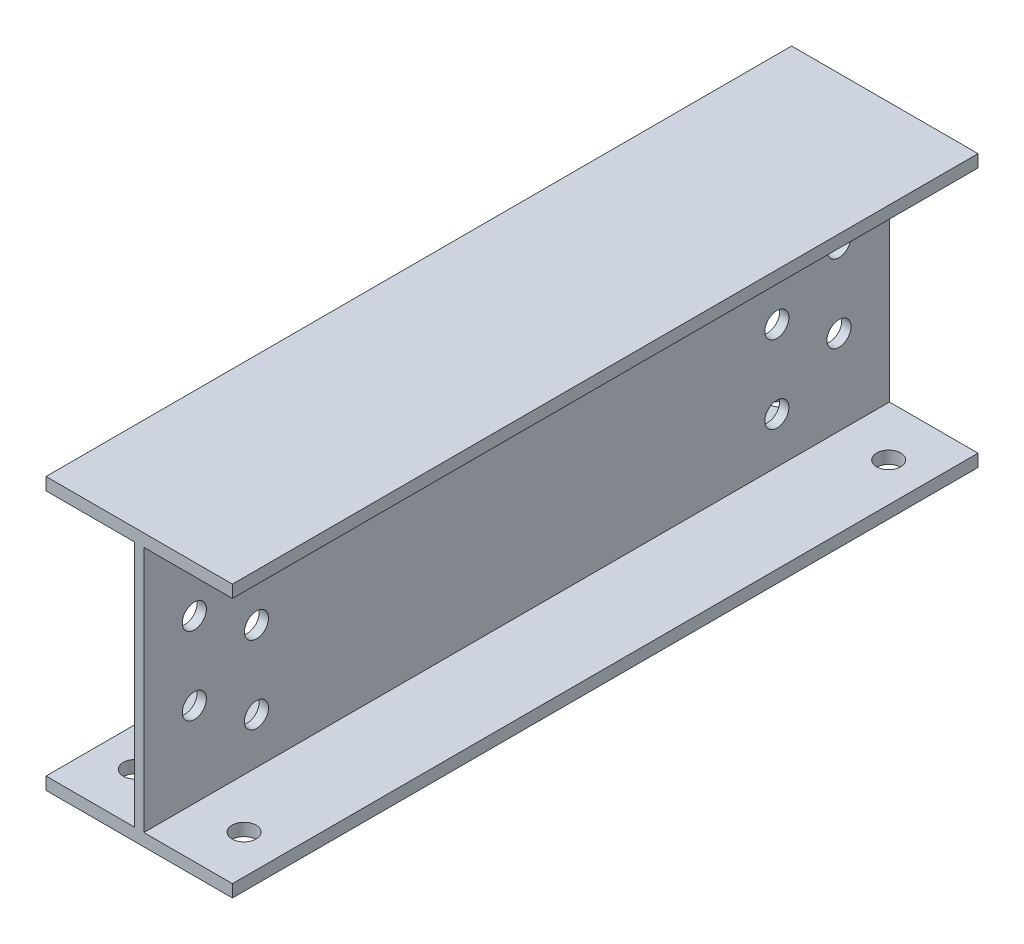
ISO-10303-21;
HEADER;
FILE_DESCRIPTION(('STEP AP214'),'2;1');
FILE_NAME('part.step','',(''),(''),'','','');
FILE_SCHEMA(('AUTOMOTIVE_DESIGN { 1 0 10303 214 1 1 1 1 }'));
ENDSEC;
DATA;
#1=APPLICATION_CONTEXT('core data for automotive mechanical design processes');
#2=APPLICATION_PROTOCOL_DEFINITION('international standard','automotive_design',2000,#1);
#3=PRODUCT_CONTEXT('',#1,'mechanical');
#4=PRODUCT('Part','Part','',(#3));
#5=PRODUCT_RELATED_PRODUCT_CATEGORY('part','',(#4));
#6=PRODUCT_DEFINITION_FORMATION('','',#4);
#7=PRODUCT_DEFINITION_CONTEXT('part definition',#1,'design');
#8=PRODUCT_DEFINITION('design','',#6,#7);
#9=PRODUCT_DEFINITION_SHAPE('','',#8);
#10=(LENGTH_UNIT() NAMED_UNIT(*) SI_UNIT(.MILLI.,.METRE.));
#11=(NAMED_UNIT(*) PLANE_ANGLE_UNIT() SI_UNIT($,.RADIAN.));
#12=(NAMED_UNIT(*) SI_UNIT($,.STERADIAN.) SOLID_ANGLE_UNIT());
#13=UNCERTAINTY_MEASURE_WITH_UNIT(LENGTH_MEASURE(1.E-05),#10,'distance_accuracy_value','');
#14=(GEOMETRIC_REPRESENTATION_CONTEXT(3) GLOBAL_UNCERTAINTY_ASSIGNED_CONTEXT((#13)) GLOBAL_UNIT_ASSIGNED_CONTEXT((#10,
#11,#12)) REPRESENTATION_CONTEXT('',''));
#15=CARTESIAN_POINT('',(0.,0.,0.));
#16=DIRECTION('',(0.,0.,1.));
#17=DIRECTION('',(1.,0.,0.));
#18=AXIS2_PLACEMENT_3D('',#15,#16,#17);
#19=CARTESIAN_POINT('',(-6.00000000000005,-159.,480.));
#20=DIRECTION('',(1.,0.,0.));
#21=DIRECTION('',(0.,1.,0.));
#22=AXIS2_PLACEMENT_3D('',#19,#20,#21);
#23=PLANE('',#22);
#24=CARTESIAN_POINT('',(-6.00000000000003,-100.,334.999961202877));
#25=DIRECTION('',(1.,0.,0.));
#26=DIRECTION('',(0.,1.,0.));
#27=AXIS2_PLACEMENT_3D('',#24,#25,#26);
#28=CIRCLE('',#27,15.5);
#29=CARTESIAN_POINT('',(-6.00000000000003,-84.5,334.999961202877));
#30=VERTEX_POINT('',#29);
#31=EDGE_CURVE('E234',#30,#30,#28,.T.);
#32=ORIENTED_EDGE('',*,*,#31,.T.);
#33=EDGE_LOOP('',(#32));
#34=FACE_BOUND('',#33,.T.);
#35=CARTESIAN_POINT('',(-6.00000000000002,50.,-415.));
#36=DIRECTION('',(1.,0.,0.));
#37=DIRECTION('',(0.,1.,0.));
#38=AXIS2_PLACEMENT_3D('',#35,#36,#37);
#39=CIRCLE('',#38,15.5);
#40=CARTESIAN_POINT('',(-6.00000000000002,65.5,-415.));
#41=VERTEX_POINT('',#40);
#42=EDGE_CURVE('E231',#41,#41,#39,.T.);
#43=ORIENTED_EDGE('',*,*,#42,.T.);
#44=EDGE_LOOP('',(#43));
#45=FACE_BOUND('',#44,.T.);
#46=CARTESIAN_POINT('',(-6.00000000000001,100.,-334.999961202877));
#47=DIRECTION('',(1.,0.,0.));
#48=DIRECTION('',(0.,1.,0.));
#49=AXIS2_PLACEMENT_3D('',#46,#47,#48);
#50=CIRCLE('',#49,15.5);
#51=CARTESIAN_POINT('',(-6.,115.5,-334.999961202877));
#52=VERTEX_POINT('',#51);
#53=EDGE_CURVE('E228',#52,#52,#50,.T.);
#54=ORIENTED_EDGE('',*,*,#53,.T.);
#55=EDGE_LOOP('',(#54));
#56=FACE_BOUND('',#55,.T.);
#57=CARTESIAN_POINT('',(-6.00000000000002,0.,-334.999961202877));
#58=DIRECTION('',(1.,0.,0.));
#59=DIRECTION('',(0.,1.,0.));
#60=AXIS2_PLACEMENT_3D('',#57,#58,#59);
#61=CIRCLE('',#60,15.5);
#62=CARTESIAN_POINT('',(-6.00000000000002,15.5,-334.999961202877));
#63=VERTEX_POINT('',#62);
#64=EDGE_CURVE('E224',#63,#63,#61,.T.);
#65=ORIENTED_EDGE('',*,*,#64,.T.);
#66=EDGE_LOOP('',(#65));
#67=FACE_BOUND('',#66,.T.);
#68=CARTESIAN_POINT('',(-6.00000000000003,-100.,-334.999961202877));
#69=DIRECTION('',(1.,0.,0.));
#70=DIRECTION('',(0.,1.,0.));
#71=AXIS2_PLACEMENT_3D('',#68,#69,#70);
#72=CIRCLE('',#71,15.5);
#73=CARTESIAN_POINT('',(-6.00000000000003,-84.5,-334.999961202877));
#74=VERTEX_POINT('',#73);
#75=EDGE_CURVE('E220',#74,#74,#72,.T.);
#76=ORIENTED_EDGE('',*,*,#75,.T.);
#77=EDGE_LOOP('',(#76));
#78=FACE_BOUND('',#77,.T.);
#79=CARTESIAN_POINT('',(-6.00000000000003,-50.,-415.));
#80=DIRECTION('',(1.,0.,0.));
#81=DIRECTION('',(0.,1.,0.));
#82=AXIS2_PLACEMENT_3D('',#79,#80,#81);
#83=CIRCLE('',#82,15.5);
#84=CARTESIAN_POINT('',(-6.00000000000003,-34.5,-415.));
#85=VERTEX_POINT('',#84);
#86=EDGE_CURVE('E216',#85,#85,#83,.T.);
#87=ORIENTED_EDGE('',*,*,#86,.T.);
#88=EDGE_LOOP('',(#87));
#89=FACE_BOUND('',#88,.T.);
#90=CARTESIAN_POINT('',(-6.00000000000003,-50.,415.));
#91=DIRECTION('',(1.,0.,0.));
#92=DIRECTION('',(0.,1.,0.));
#93=AXIS2_PLACEMENT_3D('',#90,#91,#92);
#94=CIRCLE('',#93,15.5);
#95=CARTESIAN_POINT('',(-6.00000000000003,-34.5,415.));
#96=VERTEX_POINT('',#95);
#97=EDGE_CURVE('E212',#96,#96,#94,.T.);
#98=ORIENTED_EDGE('',*,*,#97,.T.);
#99=EDGE_LOOP('',(#98));
#100=FACE_BOUND('',#99,.T.);
#101=CARTESIAN_POINT('',(-6.00000000000002,0.,334.999961202877));
#102=DIRECTION('',(1.,0.,0.));
#103=DIRECTION('',(0.,1.,0.));
#104=AXIS2_PLACEMENT_3D('',#101,#102,#103);
#105=CIRCLE('',#104,15.5);
#106=CARTESIAN_POINT('',(-6.00000000000002,15.5,334.999961202877));
#107=VERTEX_POINT('',#106);
#108=EDGE_CURVE('E208',#107,#107,#105,.T.);
#109=ORIENTED_EDGE('',*,*,#108,.T.);
#110=EDGE_LOOP('',(#109));
#111=FACE_BOUND('',#110,.T.);
#112=CARTESIAN_POINT('',(-6.00000000000001,100.,334.999961202877));
#113=DIRECTION('',(1.,0.,0.));
#114=DIRECTION('',(0.,1.,0.));
#115=AXIS2_PLACEMENT_3D('',#112,#113,#114);
#116=CIRCLE('',#115,15.5);
#117=CARTESIAN_POINT('',(-6.,115.5,334.999961202877));
#118=VERTEX_POINT('',#117);
#119=EDGE_CURVE('E204',#118,#118,#116,.T.);
#120=ORIENTED_EDGE('',*,*,#119,.T.);
#121=EDGE_LOOP('',(#120));
#122=FACE_BOUND('',#121,.T.);
#123=CARTESIAN_POINT('',(-6.00000000000002,50.,415.));
#124=DIRECTION('',(1.,0.,0.));
#125=DIRECTION('',(0.,1.,0.));
#126=AXIS2_PLACEMENT_3D('',#123,#124,#125);
#127=CIRCLE('',#126,15.5);
#128=CARTESIAN_POINT('',(-6.00000000000002,65.5,415.));
#129=VERTEX_POINT('',#128);
#130=EDGE_CURVE('E158',#129,#129,#127,.T.);
#131=ORIENTED_EDGE('',*,*,#130,.T.);
#132=EDGE_LOOP('',(#131));
#133=FACE_BOUND('',#132,.T.);
#134=DIRECTION('',(0.,-1.,0.));
#135=VECTOR('',#134,1.);
#136=CARTESIAN_POINT('',(-6.00000000000005,-159.,-480.));
#137=LINE('',#136,#135);
#138=CARTESIAN_POINT('',(-6.,159.,-480.));
#139=VERTEX_POINT('',#138);
#140=CARTESIAN_POINT('',(-6.00000000000005,-159.,-480.));
#141=VERTEX_POINT('',#140);
#142=EDGE_CURVE('E154',#139,#141,#137,.T.);
#143=ORIENTED_EDGE('',*,*,#142,.T.);
#144=DIRECTION('',(0.,0.,-1.));
#145=VECTOR('',#144,1.);
#146=CARTESIAN_POINT('',(-6.00000000000005,-159.,480.));
#147=LINE('',#146,#145);
#148=CARTESIAN_POINT('',(-6.00000000000005,-159.,480.));
#149=VERTEX_POINT('',#148);
#150=EDGE_CURVE('E11',#149,#141,#147,.T.);
#151=ORIENTED_EDGE('',*,*,#150,.F.);
#152=DIRECTION('',(0.,-1.,0.));
#153=VECTOR('',#152,1.);
#154=CARTESIAN_POINT('',(-6.00000000000005,-159.,480.));
#155=LINE('',#154,#153);
#156=CARTESIAN_POINT('',(-6.,159.,480.));
#157=VERTEX_POINT('',#156);
#158=EDGE_CURVE('E177',#157,#149,#155,.T.);
#159=ORIENTED_EDGE('',*,*,#158,.F.);
#160=DIRECTION('',(0.,0.,-1.));
#161=VECTOR('',#160,1.);
#162=CARTESIAN_POINT('',(-6.,159.,480.));
#163=LINE('',#162,#161);
#164=EDGE_CURVE('E150',#157,#139,#163,.T.);
#165=ORIENTED_EDGE('',*,*,#164,.T.);
#166=EDGE_LOOP('',(#143,#151,#159,#165));
#167=FACE_BOUND('',#166,.T.);
#168=ADVANCED_FACE('F32',(#34,#45,#56,#67,#78,#89,#100,#111,#122,#133,#167),#23,.F.);
#169=CARTESIAN_POINT('',(-120.,-159.,480.));
#170=DIRECTION('',(0.,-1.,0.));
#171=DIRECTION('',(0.,0.,-1.));
#172=AXIS2_PLACEMENT_3D('',#169,#170,#171);
#173=PLANE('',#172);
#174=CARTESIAN_POINT('',(-70.,-159.,415.));
#175=DIRECTION('',(0.,1.,0.));
#176=DIRECTION('',(0.,0.,-1.));
#177=AXIS2_PLACEMENT_3D('',#174,#175,#176);
#178=CIRCLE('',#177,15.5);
#179=CARTESIAN_POINT('',(-70.,-159.,399.5));
#180=VERTEX_POINT('',#179);
#181=EDGE_CURVE('E402',#180,#180,#178,.T.);
#182=ORIENTED_EDGE('',*,*,#181,.F.);
#183=EDGE_LOOP('',(#182));
#184=FACE_BOUND('',#183,.T.);
#185=CARTESIAN_POINT('',(-70.,-159.,-415.));
#186=DIRECTION('',(0.,1.,0.));
#187=DIRECTION('',(0.,0.,1.));
#188=AXIS2_PLACEMENT_3D('',#185,#186,#187);
#189=CIRCLE('',#188,15.5);
#190=CARTESIAN_POINT('',(-70.,-159.,-399.5));
#191=VERTEX_POINT('',#190);
#192=EDGE_CURVE('E246',#191,#191,#189,.T.);
#193=ORIENTED_EDGE('',*,*,#192,.F.);
#194=EDGE_LOOP('',(#193));
#195=FACE_BOUND('',#194,.T.);
#196=DIRECTION('',(-1.,0.,0.));
#197=VECTOR('',#196,1.);
#198=CARTESIAN_POINT('',(-120.,-159.,-480.));
#199=LINE('',#198,#197);
#200=CARTESIAN_POINT('',(-120.,-159.,-480.));
#201=VERTEX_POINT('',#200);
#202=EDGE_CURVE('E157',#141,#201,#199,.T.);
#203=ORIENTED_EDGE('',*,*,#202,.T.);
#204=DIRECTION('',(0.,0.,-1.));
#205=VECTOR('',#204,1.);
#206=CARTESIAN_POINT('',(-120.,-159.,480.));
#207=LINE('',#206,#205);
#208=CARTESIAN_POINT('',(-120.,-159.,480.));
#209=VERTEX_POINT('',#208);
#210=EDGE_CURVE('E41',#209,#201,#207,.T.);
#211=ORIENTED_EDGE('',*,*,#210,.F.);
#212=DIRECTION('',(-1.,0.,0.));
#213=VECTOR('',#212,1.);
#214=CARTESIAN_POINT('',(-120.,-159.,480.));
#215=LINE('',#214,#213);
#216=EDGE_CURVE('E105',#149,#209,#215,.T.);
#217=ORIENTED_EDGE('',*,*,#216,.F.);
#218=ORIENTED_EDGE('',*,*,#150,.T.);
#219=EDGE_LOOP('',(#203,#211,#217,#218));
#220=FACE_BOUND('',#219,.T.);
#221=ADVANCED_FACE('F306',(#184,#195,#220),#173,.F.);
#222=CARTESIAN_POINT('',(-120.,-175.,480.));
#223=DIRECTION('',(1.,0.,0.));
#224=DIRECTION('',(0.,0.,-1.));
#225=AXIS2_PLACEMENT_3D('',#222,#223,#224);
#226=PLANE('',#225);
#227=DIRECTION('',(0.,-1.,0.));
#228=VECTOR('',#227,1.);
#229=CARTESIAN_POINT('',(-120.,-175.,-480.));
#230=LINE('',#229,#228);
#231=CARTESIAN_POINT('',(-120.,-175.,-480.));
#232=VERTEX_POINT('',#231);
#233=EDGE_CURVE('E160',#201,#232,#230,.T.);
#234=ORIENTED_EDGE('',*,*,#233,.T.);
#235=DIRECTION('',(0.,0.,-1.));
#236=VECTOR('',#235,1.);
#237=CARTESIAN_POINT('',(-120.,-175.,480.));
#238=LINE('',#237,#236);
#239=CARTESIAN_POINT('',(-120.,-175.,480.));
#240=VERTEX_POINT('',#239);
#241=EDGE_CURVE('E196',#240,#232,#238,.T.);
#242=ORIENTED_EDGE('',*,*,#241,.F.);
#243=DIRECTION('',(0.,-1.,0.));
#244=VECTOR('',#243,1.);
#245=CARTESIAN_POINT('',(-120.,-175.,480.));
#246=LINE('',#245,#244);
#247=EDGE_CURVE('E267',#209,#240,#246,.T.);
#248=ORIENTED_EDGE('',*,*,#247,.F.);
#249=ORIENTED_EDGE('',*,*,#210,.T.);
#250=EDGE_LOOP('',(#234,#242,#248,#249));
#251=FACE_BOUND('',#250,.T.);
#252=ADVANCED_FACE('F310',(#251),#226,.F.);
#253=CARTESIAN_POINT('',(120.,-175.,480.));
#254=DIRECTION('',(0.,1.,0.));
#255=DIRECTION('',(-1.,0.,0.));
#256=AXIS2_PLACEMENT_3D('',#253,#254,#255);
#257=PLANE('',#256);
#258=CARTESIAN_POINT('',(70.,-175.,415.));
#259=DIRECTION('',(0.,1.,0.));
#260=DIRECTION('',(0.,0.,-1.));
#261=AXIS2_PLACEMENT_3D('',#258,#259,#260);
#262=CIRCLE('',#261,15.5);
#263=CARTESIAN_POINT('',(70.,-175.,399.5));
#264=VERTEX_POINT('',#263);
#265=EDGE_CURVE('E396',#264,#264,#262,.T.);
#266=ORIENTED_EDGE('',*,*,#265,.T.);
#267=EDGE_LOOP('',(#266));
#268=FACE_BOUND('',#267,.T.);
#269=CARTESIAN_POINT('',(-70.,-175.,415.));
#270=DIRECTION('',(0.,1.,0.));
#271=DIRECTION('',(0.,0.,-1.));
#272=AXIS2_PLACEMENT_3D('',#269,#270,#271);
#273=CIRCLE('',#272,15.5);
#274=CARTESIAN_POINT('',(-70.,-175.,399.5));
#275=VERTEX_POINT('',#274);
#276=EDGE_CURVE('E405',#275,#275,#273,.T.);
#277=ORIENTED_EDGE('',*,*,#276,.T.);
#278=EDGE_LOOP('',(#277));
#279=FACE_BOUND('',#278,.T.);
#280=CARTESIAN_POINT('',(70.,-175.,-415.));
#281=DIRECTION('',(0.,1.,0.));
#282=DIRECTION('',(0.,0.,1.));
#283=AXIS2_PLACEMENT_3D('',#280,#281,#282);
#284=CIRCLE('',#283,15.5);
#285=CARTESIAN_POINT('',(70.,-175.,-399.5));
#286=VERTEX_POINT('',#285);
#287=EDGE_CURVE('E411',#286,#286,#284,.T.);
#288=ORIENTED_EDGE('',*,*,#287,.T.);
#289=EDGE_LOOP('',(#288));
#290=FACE_BOUND('',#289,.T.);
#291=CARTESIAN_POINT('',(-70.,-175.,-415.));
#292=DIRECTION('',(0.,1.,0.));
#293=DIRECTION('',(0.,0.,1.));
#294=AXIS2_PLACEMENT_3D('',#291,#292,#293);
#295=CIRCLE('',#294,15.5);
#296=CARTESIAN_POINT('',(-70.,-175.,-399.5));
#297=VERTEX_POINT('',#296);
#298=EDGE_CURVE('E244',#297,#297,#295,.T.);
#299=ORIENTED_EDGE('',*,*,#298,.T.);
#300=EDGE_LOOP('',(#299));
#301=FACE_BOUND('',#300,.T.);
#302=DIRECTION('',(1.,0.,0.));
#303=VECTOR('',#302,1.);
#304=CARTESIAN_POINT('',(120.,-175.,-480.));
#305=LINE('',#304,#303);
#306=CARTESIAN_POINT('',(120.,-175.,-480.));
#307=VERTEX_POINT('',#306);
#308=EDGE_CURVE('E162',#232,#307,#305,.T.);
#309=ORIENTED_EDGE('',*,*,#308,.T.);
#310=DIRECTION('',(0.,0.,-1.));
#311=VECTOR('',#310,1.);
#312=CARTESIAN_POINT('',(120.,-175.,480.));
#313=LINE('',#312,#311);
#314=CARTESIAN_POINT('',(120.,-175.,480.));
#315=VERTEX_POINT('',#314);
#316=EDGE_CURVE('E193',#315,#307,#313,.T.);
#317=ORIENTED_EDGE('',*,*,#316,.F.);
#318=DIRECTION('',(1.,0.,0.));
#319=VECTOR('',#318,1.);
#320=CARTESIAN_POINT('',(120.,-175.,480.));
#321=LINE('',#320,#319);
#322=EDGE_CURVE('E269',#240,#315,#321,.T.);
#323=ORIENTED_EDGE('',*,*,#322,.F.);
#324=ORIENTED_EDGE('',*,*,#241,.T.);
#325=EDGE_LOOP('',(#309,#317,#323,#324));
#326=FACE_BOUND('',#325,.T.);
#327=ADVANCED_FACE('F430',(#268,#279,#290,#301,#326),#257,.F.);
#328=CARTESIAN_POINT('',(120.,-159.,480.));
#329=DIRECTION('',(-1.,0.,0.));
#330=DIRECTION('',(0.,0.,1.));
#331=AXIS2_PLACEMENT_3D('',#328,#329,#330);
#332=PLANE('',#331);
#333=DIRECTION('',(0.,1.,0.));
#334=VECTOR('',#333,1.);
#335=CARTESIAN_POINT('',(120.,-159.,-480.));
#336=LINE('',#335,#334);
#337=CARTESIAN_POINT('',(120.,-159.,-480.));
#338=VERTEX_POINT('',#337);
#339=EDGE_CURVE('E164',#307,#338,#336,.T.);
#340=ORIENTED_EDGE('',*,*,#339,.T.);
#341=DIRECTION('',(0.,0.,-1.));
#342=VECTOR('',#341,1.);
#343=CARTESIAN_POINT('',(120.,-159.,480.));
#344=LINE('',#343,#342);
#345=CARTESIAN_POINT('',(120.,-159.,480.));
#346=VERTEX_POINT('',#345);
#347=EDGE_CURVE('E190',#346,#338,#344,.T.);
#348=ORIENTED_EDGE('',*,*,#347,.F.);
#349=DIRECTION('',(0.,1.,0.));
#350=VECTOR('',#349,1.);
#351=CARTESIAN_POINT('',(120.,-159.,480.));
#352=LINE('',#351,#350);
#353=EDGE_CURVE('E271',#315,#346,#352,.T.);
#354=ORIENTED_EDGE('',*,*,#353,.F.);
#355=ORIENTED_EDGE('',*,*,#316,.T.);
#356=EDGE_LOOP('',(#340,#348,#354,#355));
#357=FACE_BOUND('',#356,.T.);
#358=ADVANCED_FACE('F434',(#357),#332,.F.);
#359=CARTESIAN_POINT('',(6.00000000000005,-159.,480.));
#360=DIRECTION('',(0.,-1.,0.));
#361=DIRECTION('',(1.,0.,0.));
#362=AXIS2_PLACEMENT_3D('',#359,#360,#361);
#363=PLANE('',#362);
#364=CARTESIAN_POINT('',(70.,-159.,415.));
#365=DIRECTION('',(0.,1.,0.));
#366=DIRECTION('',(0.,0.,-1.));
#367=AXIS2_PLACEMENT_3D('',#364,#365,#366);
#368=CIRCLE('',#367,15.5);
#369=CARTESIAN_POINT('',(70.,-159.,399.5));
#370=VERTEX_POINT('',#369);
#371=EDGE_CURVE('E399',#370,#370,#368,.T.);
#372=ORIENTED_EDGE('',*,*,#371,.F.);
#373=EDGE_LOOP('',(#372));
#374=FACE_BOUND('',#373,.T.);
#375=CARTESIAN_POINT('',(70.,-159.,-415.));
#376=DIRECTION('',(0.,1.,0.));
#377=DIRECTION('',(0.,0.,1.));
#378=AXIS2_PLACEMENT_3D('',#375,#376,#377);
#379=CIRCLE('',#378,15.5);
#380=CARTESIAN_POINT('',(70.,-159.,-399.5));
#381=VERTEX_POINT('',#380);
#382=EDGE_CURVE('E408',#381,#381,#379,.T.);
#383=ORIENTED_EDGE('',*,*,#382,.F.);
#384=EDGE_LOOP('',(#383));
#385=FACE_BOUND('',#384,.T.);
#386=DIRECTION('',(-1.,0.,0.));
#387=VECTOR('',#386,1.);
#388=CARTESIAN_POINT('',(6.00000000000005,-159.,-480.));
#389=LINE('',#388,#387);
#390=CARTESIAN_POINT('',(6.00000000000005,-159.,-480.));
#391=VERTEX_POINT('',#390);
#392=EDGE_CURVE('E166',#338,#391,#389,.T.);
#393=ORIENTED_EDGE('',*,*,#392,.T.);
#394=DIRECTION('',(0.,0.,-1.));
#395=VECTOR('',#394,1.);
#396=CARTESIAN_POINT('',(6.00000000000005,-159.,480.));
#397=LINE('',#396,#395);
#398=CARTESIAN_POINT('',(6.00000000000005,-159.,480.));
#399=VERTEX_POINT('',#398);
#400=EDGE_CURVE('E187',#399,#391,#397,.T.);
#401=ORIENTED_EDGE('',*,*,#400,.F.);
#402=DIRECTION('',(-1.,0.,0.));
#403=VECTOR('',#402,1.);
#404=CARTESIAN_POINT('',(6.00000000000005,-159.,480.));
#405=LINE('',#404,#403);
#406=EDGE_CURVE('E273',#346,#399,#405,.T.);
#407=ORIENTED_EDGE('',*,*,#406,.F.);
#408=ORIENTED_EDGE('',*,*,#347,.T.);
#409=EDGE_LOOP('',(#393,#401,#407,#408));
#410=FACE_BOUND('',#409,.T.);
#411=ADVANCED_FACE('F439',(#374,#385,#410),#363,.F.);
#412=CARTESIAN_POINT('',(6.,159.,480.));
#413=DIRECTION('',(-1.,0.,0.));
#414=DIRECTION('',(0.,-1.,0.));
#415=AXIS2_PLACEMENT_3D('',#412,#413,#414);
#416=PLANE('',#415);
#417=CARTESIAN_POINT('',(6.00000000000003,-100.,334.999961202877));
#418=DIRECTION('',(-1.,0.,0.));
#419=DIRECTION('',(0.,-1.,0.));
#420=AXIS2_PLACEMENT_3D('',#417,#418,#419);
#421=CIRCLE('',#420,15.5);
#422=CARTESIAN_POINT('',(6.00000000000004,-115.5,334.999961202877));
#423=VERTEX_POINT('',#422);
#424=EDGE_CURVE('E35',#423,#423,#421,.T.);
#425=ORIENTED_EDGE('',*,*,#424,.T.);
#426=EDGE_LOOP('',(#425));
#427=FACE_BOUND('',#426,.T.);
#428=CARTESIAN_POINT('',(6.00000000000003,50.,-415.));
#429=DIRECTION('',(-1.,0.,0.));
#430=DIRECTION('',(0.,-1.,0.));
#431=AXIS2_PLACEMENT_3D('',#428,#429,#430);
#432=CIRCLE('',#431,15.5);
#433=CARTESIAN_POINT('',(6.00000000000004,34.5,-415.));
#434=VERTEX_POINT('',#433);
#435=EDGE_CURVE('E232',#434,#434,#432,.T.);
#436=ORIENTED_EDGE('',*,*,#435,.T.);
#437=EDGE_LOOP('',(#436));
#438=FACE_BOUND('',#437,.T.);
#439=CARTESIAN_POINT('',(6.00000000000001,100.,-334.999961202877));
#440=DIRECTION('',(-1.,0.,0.));
#441=DIRECTION('',(0.,-1.,0.));
#442=AXIS2_PLACEMENT_3D('',#439,#440,#441);
#443=CIRCLE('',#442,15.5);
#444=CARTESIAN_POINT('',(6.00000000000001,84.5,-334.999961202877));
#445=VERTEX_POINT('',#444);
#446=EDGE_CURVE('E229',#445,#445,#443,.T.);
#447=ORIENTED_EDGE('',*,*,#446,.T.);
#448=EDGE_LOOP('',(#447));
#449=FACE_BOUND('',#448,.T.);
#450=CARTESIAN_POINT('',(6.00000000000003,0.,-334.999961202877));
#451=DIRECTION('',(-1.,0.,0.));
#452=DIRECTION('',(0.,-1.,0.));
#453=AXIS2_PLACEMENT_3D('',#450,#451,#452);
#454=CIRCLE('',#453,15.5);
#455=CARTESIAN_POINT('',(6.00000000000004,-15.5,-334.999961202877));
#456=VERTEX_POINT('',#455);
#457=EDGE_CURVE('E225',#456,#456,#454,.T.);
#458=ORIENTED_EDGE('',*,*,#457,.T.);
#459=EDGE_LOOP('',(#458));
#460=FACE_BOUND('',#459,.T.);
#461=CARTESIAN_POINT('',(6.00000000000003,-100.,-334.999961202877));
#462=DIRECTION('',(-1.,0.,0.));
#463=DIRECTION('',(0.,-1.,0.));
#464=AXIS2_PLACEMENT_3D('',#461,#462,#463);
#465=CIRCLE('',#464,15.5);
#466=CARTESIAN_POINT('',(6.00000000000004,-115.5,-334.999961202877));
#467=VERTEX_POINT('',#466);
#468=EDGE_CURVE('E221',#467,#467,#465,.T.);
#469=ORIENTED_EDGE('',*,*,#468,.T.);
#470=EDGE_LOOP('',(#469));
#471=FACE_BOUND('',#470,.T.);
#472=CARTESIAN_POINT('',(6.00000000000003,-50.,-415.));
#473=DIRECTION('',(-1.,0.,0.));
#474=DIRECTION('',(0.,-1.,0.));
#475=AXIS2_PLACEMENT_3D('',#472,#473,#474);
#476=CIRCLE('',#475,15.5);
#477=CARTESIAN_POINT('',(6.00000000000004,-65.5,-415.));
#478=VERTEX_POINT('',#477);
#479=EDGE_CURVE('E217',#478,#478,#476,.T.);
#480=ORIENTED_EDGE('',*,*,#479,.T.);
#481=EDGE_LOOP('',(#480));
#482=FACE_BOUND('',#481,.T.);
#483=CARTESIAN_POINT('',(6.00000000000003,-50.,415.));
#484=DIRECTION('',(-1.,0.,0.));
#485=DIRECTION('',(0.,-1.,0.));
#486=AXIS2_PLACEMENT_3D('',#483,#484,#485);
#487=CIRCLE('',#486,15.5);
#488=CARTESIAN_POINT('',(6.00000000000004,-65.5,415.));
#489=VERTEX_POINT('',#488);
#490=EDGE_CURVE('E213',#489,#489,#487,.T.);
#491=ORIENTED_EDGE('',*,*,#490,.T.);
#492=EDGE_LOOP('',(#491));
#493=FACE_BOUND('',#492,.T.);
#494=CARTESIAN_POINT('',(6.00000000000003,0.,334.999961202877));
#495=DIRECTION('',(-1.,0.,0.));
#496=DIRECTION('',(0.,-1.,0.));
#497=AXIS2_PLACEMENT_3D('',#494,#495,#496);
#498=CIRCLE('',#497,15.5);
#499=CARTESIAN_POINT('',(6.00000000000004,-15.5,334.999961202877));
#500=VERTEX_POINT('',#499);
#501=EDGE_CURVE('E209',#500,#500,#498,.T.);
#502=ORIENTED_EDGE('',*,*,#501,.T.);
#503=EDGE_LOOP('',(#502));
#504=FACE_BOUND('',#503,.T.);
#505=CARTESIAN_POINT('',(6.00000000000001,100.,334.999961202877));
#506=DIRECTION('',(-1.,0.,0.));
#507=DIRECTION('',(0.,-1.,0.));
#508=AXIS2_PLACEMENT_3D('',#505,#506,#507);
#509=CIRCLE('',#508,15.5);
#510=CARTESIAN_POINT('',(6.00000000000001,84.5,334.999961202877));
#511=VERTEX_POINT('',#510);
#512=EDGE_CURVE('E205',#511,#511,#509,.T.);
#513=ORIENTED_EDGE('',*,*,#512,.T.);
#514=EDGE_LOOP('',(#513));
#515=FACE_BOUND('',#514,.T.);
#516=CARTESIAN_POINT('',(6.00000000000003,50.,415.));
#517=DIRECTION('',(-1.,0.,0.));
#518=DIRECTION('',(0.,-1.,0.));
#519=AXIS2_PLACEMENT_3D('',#516,#517,#518);
#520=CIRCLE('',#519,15.5);
#521=CARTESIAN_POINT('',(6.00000000000004,34.5,415.));
#522=VERTEX_POINT('',#521);
#523=EDGE_CURVE('E201',#522,#522,#520,.T.);
#524=ORIENTED_EDGE('',*,*,#523,.T.);
#525=EDGE_LOOP('',(#524));
#526=FACE_BOUND('',#525,.T.);
#527=DIRECTION('',(0.,1.,0.));
#528=VECTOR('',#527,1.);
#529=CARTESIAN_POINT('',(6.,159.,-480.));
#530=LINE('',#529,#528);
#531=CARTESIAN_POINT('',(6.,159.,-480.));
#532=VERTEX_POINT('',#531);
#533=EDGE_CURVE('E168',#391,#532,#530,.T.);
#534=ORIENTED_EDGE('',*,*,#533,.T.);
#535=DIRECTION('',(0.,0.,-1.));
#536=VECTOR('',#535,1.);
#537=CARTESIAN_POINT('',(6.,159.,480.));
#538=LINE('',#537,#536);
#539=CARTESIAN_POINT('',(6.,159.,480.));
#540=VERTEX_POINT('',#539);
#541=EDGE_CURVE('E184',#540,#532,#538,.T.);
#542=ORIENTED_EDGE('',*,*,#541,.F.);
#543=DIRECTION('',(0.,1.,0.));
#544=VECTOR('',#543,1.);
#545=CARTESIAN_POINT('',(6.,159.,480.));
#546=LINE('',#545,#544);
#547=EDGE_CURVE('E275',#399,#540,#546,.T.);
#548=ORIENTED_EDGE('',*,*,#547,.F.);
#549=ORIENTED_EDGE('',*,*,#400,.T.);
#550=EDGE_LOOP('',(#534,#542,#548,#549));
#551=FACE_BOUND('',#550,.T.);
#552=ADVANCED_FACE('F442',(#427,#438,#449,#460,#471,#482,#493,#504,#515,#526,#551),#416,.F.);
#553=CARTESIAN_POINT('',(120.,159.,480.));
#554=DIRECTION('',(0.,1.,0.));
#555=DIRECTION('',(0.,0.,1.));
#556=AXIS2_PLACEMENT_3D('',#553,#554,#555);
#557=PLANE('',#556);
#558=DIRECTION('',(1.,0.,0.));
#559=VECTOR('',#558,1.);
#560=CARTESIAN_POINT('',(120.,159.,-480.));
#561=LINE('',#560,#559);
#562=CARTESIAN_POINT('',(120.,159.,-480.));
#563=VERTEX_POINT('',#562);
#564=EDGE_CURVE('E170',#532,#563,#561,.T.);
#565=ORIENTED_EDGE('',*,*,#564,.T.);
#566=DIRECTION('',(0.,0.,-1.));
#567=VECTOR('',#566,1.);
#568=CARTESIAN_POINT('',(120.,159.,480.));
#569=LINE('',#568,#567);
#570=CARTESIAN_POINT('',(120.,159.,480.));
#571=VERTEX_POINT('',#570);
#572=EDGE_CURVE('E181',#571,#563,#569,.T.);
#573=ORIENTED_EDGE('',*,*,#572,.F.);
#574=DIRECTION('',(1.,0.,0.));
#575=VECTOR('',#574,1.);
#576=CARTESIAN_POINT('',(120.,159.,480.));
#577=LINE('',#576,#575);
#578=EDGE_CURVE('E277',#540,#571,#577,.T.);
#579=ORIENTED_EDGE('',*,*,#578,.F.);
#580=ORIENTED_EDGE('',*,*,#541,.T.);
#581=EDGE_LOOP('',(#565,#573,#579,#580));
#582=FACE_BOUND('',#581,.T.);
#583=ADVANCED_FACE('F283',(#582),#557,.F.);
#584=CARTESIAN_POINT('',(120.,175.,480.));
#585=DIRECTION('',(-1.,0.,0.));
#586=DIRECTION('',(0.,0.,1.));
#587=AXIS2_PLACEMENT_3D('',#584,#585,#586);
#588=PLANE('',#587);
#589=DIRECTION('',(0.,1.,0.));
#590=VECTOR('',#589,1.);
#591=CARTESIAN_POINT('',(120.,175.,-480.));
#592=LINE('',#591,#590);
#593=CARTESIAN_POINT('',(120.,175.,-480.));
#594=VERTEX_POINT('',#593);
#595=EDGE_CURVE('E172',#563,#594,#592,.T.);
#596=ORIENTED_EDGE('',*,*,#595,.T.);
#597=DIRECTION('',(0.,0.,-1.));
#598=VECTOR('',#597,1.);
#599=CARTESIAN_POINT('',(120.,175.,480.));
#600=LINE('',#599,#598);
#601=CARTESIAN_POINT('',(120.,175.,480.));
#602=VERTEX_POINT('',#601);
#603=EDGE_CURVE('E145',#602,#594,#600,.T.);
#604=ORIENTED_EDGE('',*,*,#603,.F.);
#605=DIRECTION('',(0.,1.,0.));
#606=VECTOR('',#605,1.);
#607=CARTESIAN_POINT('',(120.,175.,480.));
#608=LINE('',#607,#606);
#609=EDGE_CURVE('E136',#571,#602,#608,.T.);
#610=ORIENTED_EDGE('',*,*,#609,.F.);
#611=ORIENTED_EDGE('',*,*,#572,.T.);
#612=EDGE_LOOP('',(#596,#604,#610,#611));
#613=FACE_BOUND('',#612,.T.);
#614=ADVANCED_FACE('F287',(#613),#588,.F.);
#615=CARTESIAN_POINT('',(-120.,175.,480.));
#616=DIRECTION('',(0.,-1.,0.));
#617=DIRECTION('',(0.,0.,-1.));
#618=AXIS2_PLACEMENT_3D('',#615,#616,#617);
#619=PLANE('',#618);
#620=DIRECTION('',(-1.,0.,0.));
#621=VECTOR('',#620,1.);
#622=CARTESIAN_POINT('',(-120.,175.,-480.));
#623=LINE('',#622,#621);
#624=CARTESIAN_POINT('',(-120.,175.,-480.));
#625=VERTEX_POINT('',#624);
#626=EDGE_CURVE('E144',#594,#625,#623,.T.);
#627=ORIENTED_EDGE('',*,*,#626,.T.);
#628=DIRECTION('',(0.,0.,-1.));
#629=VECTOR('',#628,1.);
#630=CARTESIAN_POINT('',(-120.,175.,480.));
#631=LINE('',#630,#629);
#632=CARTESIAN_POINT('',(-120.,175.,480.));
#633=VERTEX_POINT('',#632);
#634=EDGE_CURVE('E141',#633,#625,#631,.T.);
#635=ORIENTED_EDGE('',*,*,#634,.F.);
#636=DIRECTION('',(-1.,0.,0.));
#637=VECTOR('',#636,1.);
#638=CARTESIAN_POINT('',(-120.,175.,480.));
#639=LINE('',#638,#637);
#640=EDGE_CURVE('E130',#602,#633,#639,.T.);
#641=ORIENTED_EDGE('',*,*,#640,.F.);
#642=ORIENTED_EDGE('',*,*,#603,.T.);
#643=EDGE_LOOP('',(#627,#635,#641,#642));
#644=FACE_BOUND('',#643,.T.);
#645=ADVANCED_FACE('F142',(#644),#619,.F.);
#646=CARTESIAN_POINT('',(-120.,159.,480.));
#647=DIRECTION('',(1.,0.,0.));
#648=DIRECTION('',(0.,0.,-1.));
#649=AXIS2_PLACEMENT_3D('',#646,#647,#648);
#650=PLANE('',#649);
#651=DIRECTION('',(0.,-1.,0.));
#652=VECTOR('',#651,1.);
#653=CARTESIAN_POINT('',(-120.,159.,-480.));
#654=LINE('',#653,#652);
#655=CARTESIAN_POINT('',(-120.,159.,-480.));
#656=VERTEX_POINT('',#655);
#657=EDGE_CURVE('E91',#625,#656,#654,.T.);
#658=ORIENTED_EDGE('',*,*,#657,.T.);
#659=DIRECTION('',(0.,0.,-1.));
#660=VECTOR('',#659,1.);
#661=CARTESIAN_POINT('',(-120.,159.,480.));
#662=LINE('',#661,#660);
#663=CARTESIAN_POINT('',(-120.,159.,480.));
#664=VERTEX_POINT('',#663);
#665=EDGE_CURVE('E146',#664,#656,#662,.T.);
#666=ORIENTED_EDGE('',*,*,#665,.F.);
#667=DIRECTION('',(0.,-1.,0.));
#668=VECTOR('',#667,1.);
#669=CARTESIAN_POINT('',(-120.,159.,480.));
#670=LINE('',#669,#668);
#671=EDGE_CURVE('E134',#633,#664,#670,.T.);
#672=ORIENTED_EDGE('',*,*,#671,.F.);
#673=ORIENTED_EDGE('',*,*,#634,.T.);
#674=EDGE_LOOP('',(#658,#666,#672,#673));
#675=FACE_BOUND('',#674,.T.);
#676=ADVANCED_FACE('F148',(#675),#650,.F.);
#677=CARTESIAN_POINT('',(-6.,159.,480.));
#678=DIRECTION('',(0.,1.,0.));
#679=DIRECTION('',(0.,0.,1.));
#680=AXIS2_PLACEMENT_3D('',#677,#678,#679);
#681=PLANE('',#680);
#682=DIRECTION('',(1.,0.,0.));
#683=VECTOR('',#682,1.);
#684=CARTESIAN_POINT('',(-6.,159.,-480.));
#685=LINE('',#684,#683);
#686=EDGE_CURVE('E97',#656,#139,#685,.T.);
#687=ORIENTED_EDGE('',*,*,#686,.T.);
#688=ORIENTED_EDGE('',*,*,#164,.F.);
#689=DIRECTION('',(1.,0.,0.));
#690=VECTOR('',#689,1.);
#691=CARTESIAN_POINT('',(-6.,159.,480.));
#692=LINE('',#691,#690);
#693=EDGE_CURVE('E50',#664,#157,#692,.T.);
#694=ORIENTED_EDGE('',*,*,#693,.F.);
#695=ORIENTED_EDGE('',*,*,#665,.T.);
#696=EDGE_LOOP('',(#687,#688,#694,#695));
#697=FACE_BOUND('',#696,.T.);
#698=ADVANCED_FACE('F295',(#697),#681,.F.);
#699=CARTESIAN_POINT('',(-6.,159.,480.));
#700=DIRECTION('',(0.,0.,1.));
#701=DIRECTION('',(1.,0.,0.));
#702=AXIS2_PLACEMENT_3D('',#699,#700,#701);
#703=PLANE('',#702);
#704=ORIENTED_EDGE('',*,*,#158,.T.);
#705=ORIENTED_EDGE('',*,*,#216,.T.);
#706=ORIENTED_EDGE('',*,*,#247,.T.);
#707=ORIENTED_EDGE('',*,*,#322,.T.);
#708=ORIENTED_EDGE('',*,*,#353,.T.);
#709=ORIENTED_EDGE('',*,*,#406,.T.);
#710=ORIENTED_EDGE('',*,*,#547,.T.);
#711=ORIENTED_EDGE('',*,*,#578,.T.);
#712=ORIENTED_EDGE('',*,*,#609,.T.);
#713=ORIENTED_EDGE('',*,*,#640,.T.);
#714=ORIENTED_EDGE('',*,*,#671,.T.);
#715=ORIENTED_EDGE('',*,*,#693,.T.);
#716=EDGE_LOOP('',(#704,#705,#706,#707,#708,#709,#710,#711,#712,#713,#714,#715));
#717=FACE_BOUND('',#716,.T.);
#718=ADVANCED_FACE('F132',(#717),#703,.T.);
#719=CARTESIAN_POINT('',(-6.,159.,-480.));
#720=DIRECTION('',(0.,0.,1.));
#721=DIRECTION('',(1.,0.,0.));
#722=AXIS2_PLACEMENT_3D('',#719,#720,#721);
#723=PLANE('',#722);
#724=ORIENTED_EDGE('',*,*,#142,.F.);
#725=ORIENTED_EDGE('',*,*,#686,.F.);
#726=ORIENTED_EDGE('',*,*,#657,.F.);
#727=ORIENTED_EDGE('',*,*,#626,.F.);
#728=ORIENTED_EDGE('',*,*,#595,.F.);
#729=ORIENTED_EDGE('',*,*,#564,.F.);
#730=ORIENTED_EDGE('',*,*,#533,.F.);
#731=ORIENTED_EDGE('',*,*,#392,.F.);
#732=ORIENTED_EDGE('',*,*,#339,.F.);
#733=ORIENTED_EDGE('',*,*,#308,.F.);
#734=ORIENTED_EDGE('',*,*,#233,.F.);
#735=ORIENTED_EDGE('',*,*,#202,.F.);
#736=EDGE_LOOP('',(#724,#725,#726,#727,#728,#729,#730,#731,#732,#733,#734,#735));
#737=FACE_BOUND('',#736,.T.);
#738=ADVANCED_FACE('F290',(#737),#723,.F.);
#739=CARTESIAN_POINT('',(-120.,50.,415.));
#740=DIRECTION('',(1.,0.,0.));
#741=DIRECTION('',(0.,0.,-1.));
#742=AXIS2_PLACEMENT_3D('',#739,#740,#741);
#743=CYLINDRICAL_SURFACE('',#742,15.5);
#744=ORIENTED_EDGE('',*,*,#523,.F.);
#745=EDGE_LOOP('',(#744));
#746=FACE_BOUND('',#745,.T.);
#747=ORIENTED_EDGE('',*,*,#130,.F.);
#748=EDGE_LOOP('',(#747));
#749=FACE_BOUND('',#748,.T.);
#750=ADVANCED_FACE('F331',(#746,#749),#743,.F.);
#751=CARTESIAN_POINT('',(-120.,100.,334.999961202877));
#752=DIRECTION('',(1.,0.,0.));
#753=DIRECTION('',(0.,0.,-1.));
#754=AXIS2_PLACEMENT_3D('',#751,#752,#753);
#755=CYLINDRICAL_SURFACE('',#754,15.5);
#756=ORIENTED_EDGE('',*,*,#512,.F.);
#757=EDGE_LOOP('',(#756));
#758=FACE_BOUND('',#757,.T.);
#759=ORIENTED_EDGE('',*,*,#119,.F.);
#760=EDGE_LOOP('',(#759));
#761=FACE_BOUND('',#760,.T.);
#762=ADVANCED_FACE('F333',(#758,#761),#755,.F.);
#763=CARTESIAN_POINT('',(-120.,0.,334.999961202877));
#764=DIRECTION('',(1.,0.,0.));
#765=DIRECTION('',(0.,0.,-1.));
#766=AXIS2_PLACEMENT_3D('',#763,#764,#765);
#767=CYLINDRICAL_SURFACE('',#766,15.5);
#768=ORIENTED_EDGE('',*,*,#501,.F.);
#769=EDGE_LOOP('',(#768));
#770=FACE_BOUND('',#769,.T.);
#771=ORIENTED_EDGE('',*,*,#108,.F.);
#772=EDGE_LOOP('',(#771));
#773=FACE_BOUND('',#772,.T.);
#774=ADVANCED_FACE('F340',(#770,#773),#767,.F.);
#775=CARTESIAN_POINT('',(-120.,-50.,415.));
#776=DIRECTION('',(1.,0.,0.));
#777=DIRECTION('',(0.,0.,-1.));
#778=AXIS2_PLACEMENT_3D('',#775,#776,#777);
#779=CYLINDRICAL_SURFACE('',#778,15.5);
#780=ORIENTED_EDGE('',*,*,#490,.F.);
#781=EDGE_LOOP('',(#780));
#782=FACE_BOUND('',#781,.T.);
#783=ORIENTED_EDGE('',*,*,#97,.F.);
#784=EDGE_LOOP('',(#783));
#785=FACE_BOUND('',#784,.T.);
#786=ADVANCED_FACE('F347',(#782,#785),#779,.F.);
#787=CARTESIAN_POINT('',(-120.,-50.,-415.));
#788=DIRECTION('',(1.,0.,0.));
#789=DIRECTION('',(0.,0.,-1.));
#790=AXIS2_PLACEMENT_3D('',#787,#788,#789);
#791=CYLINDRICAL_SURFACE('',#790,15.5);
#792=ORIENTED_EDGE('',*,*,#479,.F.);
#793=EDGE_LOOP('',(#792));
#794=FACE_BOUND('',#793,.T.);
#795=ORIENTED_EDGE('',*,*,#86,.F.);
#796=EDGE_LOOP('',(#795));
#797=FACE_BOUND('',#796,.T.);
#798=ADVANCED_FACE('F351',(#794,#797),#791,.F.);
#799=CARTESIAN_POINT('',(-120.,-100.,-334.999961202877));
#800=DIRECTION('',(1.,0.,0.));
#801=DIRECTION('',(0.,0.,-1.));
#802=AXIS2_PLACEMENT_3D('',#799,#800,#801);
#803=CYLINDRICAL_SURFACE('',#802,15.5);
#804=ORIENTED_EDGE('',*,*,#468,.F.);
#805=EDGE_LOOP('',(#804));
#806=FACE_BOUND('',#805,.T.);
#807=ORIENTED_EDGE('',*,*,#75,.F.);
#808=EDGE_LOOP('',(#807));
#809=FACE_BOUND('',#808,.T.);
#810=ADVANCED_FACE('F355',(#806,#809),#803,.F.);
#811=CARTESIAN_POINT('',(-120.,0.,-334.999961202877));
#812=DIRECTION('',(1.,0.,0.));
#813=DIRECTION('',(0.,0.,-1.));
#814=AXIS2_PLACEMENT_3D('',#811,#812,#813);
#815=CYLINDRICAL_SURFACE('',#814,15.5);
#816=ORIENTED_EDGE('',*,*,#457,.F.);
#817=EDGE_LOOP('',(#816));
#818=FACE_BOUND('',#817,.T.);
#819=ORIENTED_EDGE('',*,*,#64,.F.);
#820=EDGE_LOOP('',(#819));
#821=FACE_BOUND('',#820,.T.);
#822=ADVANCED_FACE('F359',(#818,#821),#815,.F.);
#823=CARTESIAN_POINT('',(-120.,100.,-334.999961202877));
#824=DIRECTION('',(1.,0.,0.));
#825=DIRECTION('',(0.,0.,-1.));
#826=AXIS2_PLACEMENT_3D('',#823,#824,#825);
#827=CYLINDRICAL_SURFACE('',#826,15.5);
#828=ORIENTED_EDGE('',*,*,#446,.F.);
#829=EDGE_LOOP('',(#828));
#830=FACE_BOUND('',#829,.T.);
#831=ORIENTED_EDGE('',*,*,#53,.F.);
#832=EDGE_LOOP('',(#831));
#833=FACE_BOUND('',#832,.T.);
#834=ADVANCED_FACE('F363',(#830,#833),#827,.F.);
#835=CARTESIAN_POINT('',(-120.,50.,-415.));
#836=DIRECTION('',(1.,0.,0.));
#837=DIRECTION('',(0.,0.,-1.));
#838=AXIS2_PLACEMENT_3D('',#835,#836,#837);
#839=CYLINDRICAL_SURFACE('',#838,15.5);
#840=ORIENTED_EDGE('',*,*,#435,.F.);
#841=EDGE_LOOP('',(#840));
#842=FACE_BOUND('',#841,.T.);
#843=ORIENTED_EDGE('',*,*,#42,.F.);
#844=EDGE_LOOP('',(#843));
#845=FACE_BOUND('',#844,.T.);
#846=ADVANCED_FACE('F367',(#842,#845),#839,.F.);
#847=CARTESIAN_POINT('',(-120.,-100.,334.999961202877));
#848=DIRECTION('',(1.,0.,0.));
#849=DIRECTION('',(0.,0.,-1.));
#850=AXIS2_PLACEMENT_3D('',#847,#848,#849);
#851=CYLINDRICAL_SURFACE('',#850,15.5);
#852=ORIENTED_EDGE('',*,*,#424,.F.);
#853=EDGE_LOOP('',(#852));
#854=FACE_BOUND('',#853,.T.);
#855=ORIENTED_EDGE('',*,*,#31,.F.);
#856=EDGE_LOOP('',(#855));
#857=FACE_BOUND('',#856,.T.);
#858=ADVANCED_FACE('F371',(#854,#857),#851,.F.);
#859=CARTESIAN_POINT('',(-70.,-175.,-415.));
#860=DIRECTION('',(0.,1.,0.));
#861=DIRECTION('',(0.,0.,1.));
#862=AXIS2_PLACEMENT_3D('',#859,#860,#861);
#863=CYLINDRICAL_SURFACE('',#862,15.5);
#864=ORIENTED_EDGE('',*,*,#298,.F.);
#865=EDGE_LOOP('',(#864));
#866=FACE_BOUND('',#865,.T.);
#867=ORIENTED_EDGE('',*,*,#192,.T.);
#868=EDGE_LOOP('',(#867));
#869=FACE_BOUND('',#868,.T.);
#870=ADVANCED_FACE('F375',(#866,#869),#863,.F.);
#871=CARTESIAN_POINT('',(70.,-175.,-415.));
#872=DIRECTION('',(0.,1.,0.));
#873=DIRECTION('',(0.,0.,1.));
#874=AXIS2_PLACEMENT_3D('',#871,#872,#873);
#875=CYLINDRICAL_SURFACE('',#874,15.5);
#876=ORIENTED_EDGE('',*,*,#287,.F.);
#877=EDGE_LOOP('',(#876));
#878=FACE_BOUND('',#877,.T.);
#879=ORIENTED_EDGE('',*,*,#382,.T.);
#880=EDGE_LOOP('',(#879));
#881=FACE_BOUND('',#880,.T.);
#882=ADVANCED_FACE('F379',(#878,#881),#875,.F.);
#883=CARTESIAN_POINT('',(-70.,-175.,415.));
#884=DIRECTION('',(0.,1.,0.));
#885=DIRECTION('',(0.,0.,1.));
#886=AXIS2_PLACEMENT_3D('',#883,#884,#885);
#887=CYLINDRICAL_SURFACE('',#886,15.5);
#888=ORIENTED_EDGE('',*,*,#276,.F.);
#889=EDGE_LOOP('',(#888));
#890=FACE_BOUND('',#889,.T.);
#891=ORIENTED_EDGE('',*,*,#181,.T.);
#892=EDGE_LOOP('',(#891));
#893=FACE_BOUND('',#892,.T.);
#894=ADVANCED_FACE('F383',(#890,#893),#887,.F.);
#895=CARTESIAN_POINT('',(70.,-175.,415.));
#896=DIRECTION('',(0.,1.,0.));
#897=DIRECTION('',(0.,0.,1.));
#898=AXIS2_PLACEMENT_3D('',#895,#896,#897);
#899=CYLINDRICAL_SURFACE('',#898,15.5);
#900=ORIENTED_EDGE('',*,*,#265,.F.);
#901=EDGE_LOOP('',(#900));
#902=FACE_BOUND('',#901,.T.);
#903=ORIENTED_EDGE('',*,*,#371,.T.);
#904=EDGE_LOOP('',(#903));
#905=FACE_BOUND('',#904,.T.);
#906=ADVANCED_FACE('F387',(#902,#905),#899,.F.);
#907=CLOSED_SHELL('',(#168,#221,#252,#327,#358,#411,#552,#583,#614,#645,#676,#698,#718,#738,
#750,#762,#774,#786,#798,#810,#822,#834,#846,#858,#870,#882,#894,#906));
#908=MANIFOLD_SOLID_BREP('B2',#907);
#909=ADVANCED_BREP_SHAPE_REPRESENTATION('',(#18,#908),#14);
#910=SHAPE_DEFINITION_REPRESENTATION(#9,#909);
ENDSEC;
END-ISO-10303-21;
